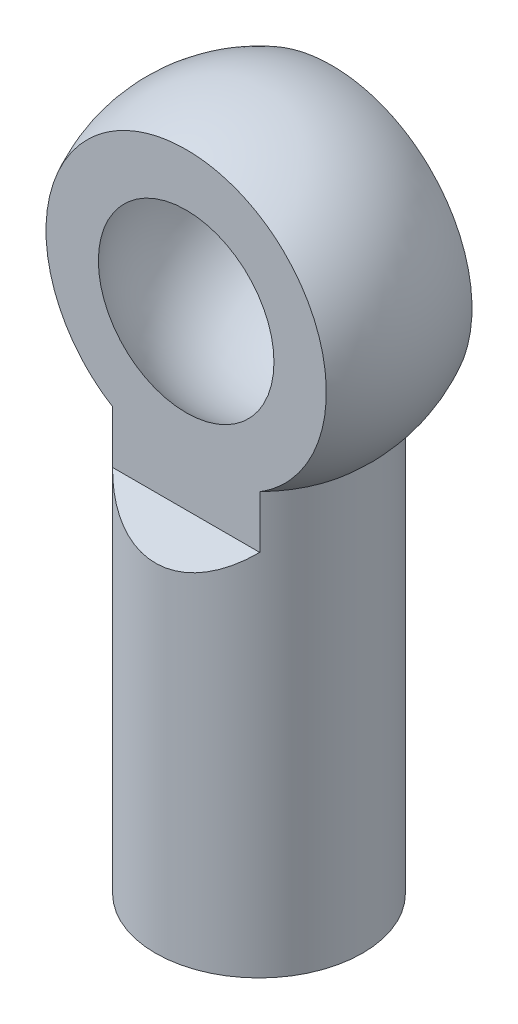
ISO-10303-21;
HEADER;
FILE_DESCRIPTION(('STEP AP214'),'2;1');
FILE_NAME('part.step','',(''),(''),'','','');
FILE_SCHEMA(('AUTOMOTIVE_DESIGN { 1 0 10303 214 1 1 1 1 }'));
ENDSEC;
DATA;
#1=APPLICATION_CONTEXT('core data for automotive mechanical design processes');
#2=APPLICATION_PROTOCOL_DEFINITION('international standard','automotive_design',2000,#1);
#3=PRODUCT_CONTEXT('',#1,'mechanical');
#4=PRODUCT('Part','Part','',(#3));
#5=PRODUCT_RELATED_PRODUCT_CATEGORY('part','',(#4));
#6=PRODUCT_DEFINITION_FORMATION('','',#4);
#7=PRODUCT_DEFINITION_CONTEXT('part definition',#1,'design');
#8=PRODUCT_DEFINITION('design','',#6,#7);
#9=PRODUCT_DEFINITION_SHAPE('','',#8);
#10=(LENGTH_UNIT() NAMED_UNIT(*) SI_UNIT(.MILLI.,.METRE.));
#11=(NAMED_UNIT(*) PLANE_ANGLE_UNIT() SI_UNIT($,.RADIAN.));
#12=(NAMED_UNIT(*) SI_UNIT($,.STERADIAN.) SOLID_ANGLE_UNIT());
#13=UNCERTAINTY_MEASURE_WITH_UNIT(LENGTH_MEASURE(1.E-05),#10,'distance_accuracy_value','');
#14=(GEOMETRIC_REPRESENTATION_CONTEXT(3) GLOBAL_UNCERTAINTY_ASSIGNED_CONTEXT((#13)) GLOBAL_UNIT_ASSIGNED_CONTEXT((#10,
#11,#12)) REPRESENTATION_CONTEXT('',''));
#15=CARTESIAN_POINT('',(0.,0.,0.));
#16=DIRECTION('',(0.,0.,1.));
#17=DIRECTION('',(1.,0.,0.));
#18=AXIS2_PLACEMENT_3D('',#15,#16,#17);
#19=CARTESIAN_POINT('',(-4.5,20.3907899194006,-2.075));
#20=DIRECTION('',(0.,0.,1.));
#21=DIRECTION('',(0.,-1.,0.));
#22=AXIS2_PLACEMENT_3D('',#19,#20,#21);
#23=PLANE('',#22);
#24=CARTESIAN_POINT('',(0.,15.3981612675092,-2.075));
#25=DIRECTION('',(0.,0.,1.));
#26=DIRECTION('',(0.,-1.,0.));
#27=AXIS2_PLACEMENT_3D('',#24,#25,#26);
#28=CIRCLE('',#27,3.99304082122885);
#29=CARTESIAN_POINT('',(2.0968726713847,12.,-2.075));
#30=VERTEX_POINT('',#29);
#31=CARTESIAN_POINT('',(-2.0968726713847,12.,-2.075));
#32=VERTEX_POINT('',#31);
#33=EDGE_CURVE('E122',#30,#32,#28,.T.);
#34=ORIENTED_EDGE('',*,*,#33,.F.);
#35=DIRECTION('',(0.,-1.,0.));
#36=VECTOR('',#35,1.);
#37=CARTESIAN_POINT('',(2.0968726713847,12.,-2.075));
#38=LINE('',#37,#36);
#39=CARTESIAN_POINT('',(2.0968726713847,10.5,-2.075));
#40=VERTEX_POINT('',#39);
#41=EDGE_CURVE('E95',#40,#30,#38,.F.);
#42=ORIENTED_EDGE('',*,*,#41,.F.);
#43=DIRECTION('',(1.,0.,0.));
#44=VECTOR('',#43,1.);
#45=CARTESIAN_POINT('',(-4.5,10.5,-2.075));
#46=LINE('',#45,#44);
#47=CARTESIAN_POINT('',(-2.0968726713847,10.5,-2.075));
#48=VERTEX_POINT('',#47);
#49=EDGE_CURVE('E89',#48,#40,#46,.T.);
#50=ORIENTED_EDGE('',*,*,#49,.F.);
#51=DIRECTION('',(0.,-1.,0.));
#52=VECTOR('',#51,1.);
#53=CARTESIAN_POINT('',(-2.0968726713847,12.,-2.075));
#54=LINE('',#53,#52);
#55=EDGE_CURVE('E59',#32,#48,#54,.T.);
#56=ORIENTED_EDGE('',*,*,#55,.F.);
#57=EDGE_LOOP('',(#34,#42,#50,#56));
#58=FACE_BOUND('',#57,.T.);
#59=CARTESIAN_POINT('',(0.,15.3981612675092,-2.075));
#60=DIRECTION('',(0.,0.,1.));
#61=DIRECTION('',(0.,-1.,0.));
#62=AXIS2_PLACEMENT_3D('',#59,#60,#61);
#63=CIRCLE('',#62,3.40000005799999);
#64=CARTESIAN_POINT('',(0.,11.9981612095092,-2.075));
#65=VERTEX_POINT('',#64);
#66=EDGE_CURVE('E13',#65,#65,#63,.F.);
#67=ORIENTED_EDGE('',*,*,#66,.F.);
#68=EDGE_LOOP('',(#67));
#69=FACE_BOUND('',#68,.T.);
#70=ADVANCED_FACE('F44',(#58,#69),#23,.F.);
#71=CARTESIAN_POINT('',(0.,12.,0.));
#72=DIRECTION('',(0.,-1.,0.));
#73=DIRECTION('',(0.,0.,-1.));
#74=AXIS2_PLACEMENT_3D('',#71,#72,#73);
#75=CYLINDRICAL_SURFACE('',#74,2.95);
#76=CARTESIAN_POINT('',(0.,12.,0.));
#77=DIRECTION('',(0.,1.,0.));
#78=DIRECTION('',(0.,0.,1.));
#79=AXIS2_PLACEMENT_3D('',#76,#77,#78);
#80=CIRCLE('',#79,2.95);
#81=CARTESIAN_POINT('',(2.0968726713847,12.,2.075));
#82=VERTEX_POINT('',#81);
#83=EDGE_CURVE('E119',#82,#30,#80,.T.);
#84=ORIENTED_EDGE('',*,*,#83,.F.);
#85=DIRECTION('',(0.,-1.,0.));
#86=VECTOR('',#85,1.);
#87=CARTESIAN_POINT('',(2.0968726713847,12.,2.075));
#88=LINE('',#87,#86);
#89=CARTESIAN_POINT('',(2.0968726713847,10.5,2.075));
#90=VERTEX_POINT('',#89);
#91=EDGE_CURVE('E67',#82,#90,#88,.T.);
#92=ORIENTED_EDGE('',*,*,#91,.T.);
#93=CARTESIAN_POINT('',(0.,12.575,0.));
#94=DIRECTION('',(0.,-0.707106781186544,-0.707106781186551));
#95=DIRECTION('',(0.,-0.707106781186551,0.707106781186544));
#96=AXIS2_PLACEMENT_3D('',#93,#94,#95);
#97=ELLIPSE('',#96,4.17193000900066,2.95);
#98=CARTESIAN_POINT('',(-2.0968726713847,10.5,2.075));
#99=VERTEX_POINT('',#98);
#100=EDGE_CURVE('E52',#90,#99,#97,.T.);
#101=ORIENTED_EDGE('',*,*,#100,.T.);
#102=DIRECTION('',(0.,-1.,0.));
#103=VECTOR('',#102,1.);
#104=CARTESIAN_POINT('',(-2.0968726713847,12.,2.075));
#105=LINE('',#104,#103);
#106=CARTESIAN_POINT('',(-2.0968726713847,12.,2.075));
#107=VERTEX_POINT('',#106);
#108=EDGE_CURVE('E105',#99,#107,#105,.F.);
#109=ORIENTED_EDGE('',*,*,#108,.T.);
#110=EDGE_CURVE('E104',#32,#107,#80,.T.);
#111=ORIENTED_EDGE('',*,*,#110,.F.);
#112=ORIENTED_EDGE('',*,*,#55,.T.);
#113=CARTESIAN_POINT('',(0.,12.575,0.));
#114=DIRECTION('',(0.,-0.707106781186544,0.707106781186551));
#115=DIRECTION('',(0.,-0.707106781186551,-0.707106781186544));
#116=AXIS2_PLACEMENT_3D('',#113,#114,#115);
#117=ELLIPSE('',#116,4.17193000900066,2.95);
#118=EDGE_CURVE('E87',#48,#40,#117,.T.);
#119=ORIENTED_EDGE('',*,*,#118,.T.);
#120=ORIENTED_EDGE('',*,*,#41,.T.);
#121=EDGE_LOOP('',(#84,#92,#101,#109,#111,#112,#119,#120));
#122=FACE_BOUND('',#121,.T.);
#123=CARTESIAN_POINT('',(0.,0.,0.));
#124=DIRECTION('',(0.,1.,0.));
#125=DIRECTION('',(0.,0.,1.));
#126=AXIS2_PLACEMENT_3D('',#123,#124,#125);
#127=CIRCLE('',#126,2.95);
#128=CARTESIAN_POINT('',(0.,0.,2.95));
#129=VERTEX_POINT('',#128);
#130=EDGE_CURVE('E115',#129,#129,#127,.T.);
#131=ORIENTED_EDGE('',*,*,#130,.T.);
#132=EDGE_LOOP('',(#131));
#133=FACE_BOUND('',#132,.T.);
#134=ADVANCED_FACE('F46',(#122,#133),#75,.T.);
#135=CARTESIAN_POINT('',(0.,0.,0.));
#136=DIRECTION('',(0.,1.,0.));
#137=DIRECTION('',(0.,0.,1.));
#138=AXIS2_PLACEMENT_3D('',#135,#136,#137);
#139=PLANE('',#138);
#140=CARTESIAN_POINT('',(0.,0.,0.));
#141=DIRECTION('',(0.,-1.,0.));
#142=DIRECTION('',(0.,0.,-1.));
#143=AXIS2_PLACEMENT_3D('',#140,#141,#142);
#144=CIRCLE('',#143,1.5);
#145=CARTESIAN_POINT('',(0.,0.,-1.5));
#146=VERTEX_POINT('',#145);
#147=EDGE_CURVE('E116',#146,#146,#144,.T.);
#148=ORIENTED_EDGE('',*,*,#147,.F.);
#149=EDGE_LOOP('',(#148));
#150=FACE_BOUND('',#149,.T.);
#151=ORIENTED_EDGE('',*,*,#130,.F.);
#152=EDGE_LOOP('',(#151));
#153=FACE_BOUND('',#152,.T.);
#154=ADVANCED_FACE('F166',(#150,#153),#139,.F.);
#155=CARTESIAN_POINT('',(0.,11.,0.));
#156=DIRECTION('',(0.,-1.,0.));
#157=DIRECTION('',(0.,0.,-1.));
#158=AXIS2_PLACEMENT_3D('',#155,#156,#157);
#159=CYLINDRICAL_SURFACE('',#158,1.5);
#160=CARTESIAN_POINT('',(0.,11.,0.));
#161=DIRECTION('',(0.,-1.,0.));
#162=DIRECTION('',(0.,0.,-1.));
#163=AXIS2_PLACEMENT_3D('',#160,#161,#162);
#164=CIRCLE('',#163,1.5);
#165=CARTESIAN_POINT('',(0.,11.,-1.5));
#166=VERTEX_POINT('',#165);
#167=EDGE_CURVE('E112',#166,#166,#164,.T.);
#168=ORIENTED_EDGE('',*,*,#167,.F.);
#169=EDGE_LOOP('',(#168));
#170=FACE_BOUND('',#169,.T.);
#171=ORIENTED_EDGE('',*,*,#147,.T.);
#172=EDGE_LOOP('',(#171));
#173=FACE_BOUND('',#172,.T.);
#174=ADVANCED_FACE('F245',(#170,#173),#159,.F.);
#175=CARTESIAN_POINT('',(0.,11.,0.));
#176=DIRECTION('',(0.,-1.,0.));
#177=DIRECTION('',(0.,0.,-1.));
#178=AXIS2_PLACEMENT_3D('',#175,#176,#177);
#179=PLANE('',#178);
#180=CARTESIAN_POINT('',(0.,11.,0.));
#181=DIRECTION('',(0.,-1.,0.));
#182=DIRECTION('',(0.,0.,-1.));
#183=AXIS2_PLACEMENT_3D('',#180,#181,#182);
#184=CIRCLE('',#183,0.951933540212518);
#185=CARTESIAN_POINT('',(0.,11.,-0.951933540212518));
#186=VERTEX_POINT('',#185);
#187=EDGE_CURVE('E111',#186,#186,#184,.F.);
#188=ORIENTED_EDGE('',*,*,#187,.T.);
#189=EDGE_LOOP('',(#188));
#190=FACE_BOUND('',#189,.T.);
#191=ORIENTED_EDGE('',*,*,#167,.T.);
#192=EDGE_LOOP('',(#191));
#193=FACE_BOUND('',#192,.T.);
#194=ADVANCED_FACE('F158',(#190,#193),#179,.T.);
#195=CARTESIAN_POINT('',(0.,15.3981612675092,0.));
#196=DIRECTION('',(0.,1.,0.));
#197=DIRECTION('',(0.,0.,-1.));
#198=AXIS2_PLACEMENT_3D('',#195,#196,#197);
#199=SPHERICAL_SURFACE('',#198,4.5);
#200=ORIENTED_EDGE('',*,*,#187,.F.);
#201=EDGE_LOOP('',(#200));
#202=FACE_BOUND('',#201,.T.);
#203=ADVANCED_FACE('F150',(#202),#199,.T.);
#204=ORIENTED_EDGE('',*,*,#110,.T.);
#205=CARTESIAN_POINT('',(0.,15.3981612675092,2.075));
#206=DIRECTION('',(0.,0.,-1.));
#207=DIRECTION('',(0.,1.,0.));
#208=AXIS2_PLACEMENT_3D('',#205,#206,#207);
#209=CIRCLE('',#208,3.99304082122885);
#210=EDGE_CURVE('E92',#107,#82,#209,.T.);
#211=ORIENTED_EDGE('',*,*,#210,.T.);
#212=ORIENTED_EDGE('',*,*,#83,.T.);
#213=ORIENTED_EDGE('',*,*,#33,.T.);
#214=EDGE_LOOP('',(#204,#211,#212,#213));
#215=FACE_BOUND('',#214,.T.);
#216=ADVANCED_FACE('F148',(#215),#199,.T.);
#217=CARTESIAN_POINT('',(-4.5,10.5,-2.075));
#218=DIRECTION('',(0.,-0.707106781186544,0.707106781186551));
#219=DIRECTION('',(0.,-0.707106781186551,-0.707106781186544));
#220=AXIS2_PLACEMENT_3D('',#217,#218,#219);
#221=PLANE('',#220);
#222=ORIENTED_EDGE('',*,*,#49,.T.);
#223=ORIENTED_EDGE('',*,*,#118,.F.);
#224=EDGE_LOOP('',(#222,#223));
#225=FACE_BOUND('',#224,.T.);
#226=ADVANCED_FACE('F88',(#225),#221,.F.);
#227=CARTESIAN_POINT('',(-4.5,10.5,2.075));
#228=DIRECTION('',(0.,-0.707106781186544,-0.707106781186551));
#229=DIRECTION('',(0.,0.707106781186551,-0.707106781186544));
#230=AXIS2_PLACEMENT_3D('',#227,#228,#229);
#231=PLANE('',#230);
#232=DIRECTION('',(1.,0.,0.));
#233=VECTOR('',#232,1.);
#234=CARTESIAN_POINT('',(-4.5,10.5,2.075));
#235=LINE('',#234,#233);
#236=EDGE_CURVE('E96',#99,#90,#235,.T.);
#237=ORIENTED_EDGE('',*,*,#236,.F.);
#238=ORIENTED_EDGE('',*,*,#100,.F.);
#239=EDGE_LOOP('',(#237,#238));
#240=FACE_BOUND('',#239,.T.);
#241=ADVANCED_FACE('F156',(#240),#231,.F.);
#242=CARTESIAN_POINT('',(-4.5,20.3907899194006,2.075));
#243=DIRECTION('',(0.,0.,-1.));
#244=DIRECTION('',(0.,1.,0.));
#245=AXIS2_PLACEMENT_3D('',#242,#243,#244);
#246=PLANE('',#245);
#247=CARTESIAN_POINT('',(0.,15.3981612675092,2.075));
#248=DIRECTION('',(0.,0.,-1.));
#249=DIRECTION('',(0.,1.,0.));
#250=AXIS2_PLACEMENT_3D('',#247,#248,#249);
#251=CIRCLE('',#250,2.50137462208283);
#252=CARTESIAN_POINT('',(0.,17.8995358895921,2.075));
#253=VERTEX_POINT('',#252);
#254=EDGE_CURVE('E97',#253,#253,#251,.F.);
#255=ORIENTED_EDGE('',*,*,#254,.F.);
#256=EDGE_LOOP('',(#255));
#257=FACE_BOUND('',#256,.T.);
#258=ORIENTED_EDGE('',*,*,#210,.F.);
#259=ORIENTED_EDGE('',*,*,#108,.F.);
#260=ORIENTED_EDGE('',*,*,#236,.T.);
#261=ORIENTED_EDGE('',*,*,#91,.F.);
#262=EDGE_LOOP('',(#258,#259,#260,#261));
#263=FACE_BOUND('',#262,.T.);
#264=ADVANCED_FACE('F145',(#257,#263),#246,.F.);
#265=CARTESIAN_POINT('',(0.,15.3981612675092,0.));
#266=DIRECTION('',(0.,0.,1.));
#267=DIRECTION('',(0.,1.,0.));
#268=AXIS2_PLACEMENT_3D('',#265,#266,#267);
#269=SPHERICAL_SURFACE('',#268,3.25);
#270=CARTESIAN_POINT('',(0.,15.3981612675092,-2.075));
#271=DIRECTION('',(0.,0.,-1.));
#272=DIRECTION('',(0.,1.,0.));
#273=AXIS2_PLACEMENT_3D('',#270,#271,#272);
#274=CIRCLE('',#273,2.50137462208283);
#275=CARTESIAN_POINT('',(0.,17.8995358895921,-2.075));
#276=VERTEX_POINT('',#275);
#277=EDGE_CURVE('E140',#276,#276,#274,.T.);
#278=CARTESIAN_POINT('',(0.,17.8995358895921,2.075));
#279=CARTESIAN_POINT('',(0.,17.9294725313673,2.03891299293474));
#280=CARTESIAN_POINT('',(0.,17.9586271577245,2.00217733623271));
#281=CARTESIAN_POINT('',(0.,18.0153201615577,1.92747934004052));
#282=CARTESIAN_POINT('',(0.,18.0428585390337,1.88951700055036));
#283=CARTESIAN_POINT('',(0.,18.0962668270596,1.81243625526729));
#284=CARTESIAN_POINT('',(0.,18.1221367376094,1.77331784947439));
#285=CARTESIAN_POINT('',(0.,18.1721598098411,1.69399836896055));
#286=CARTESIAN_POINT('',(0.,18.1963129715228,1.65379729423961));
#287=CARTESIAN_POINT('',(0.,18.2428572621402,1.57238773608666));
#288=CARTESIAN_POINT('',(0.,18.2652483910759,1.53117925265464));
#289=CARTESIAN_POINT('',(0.,18.3082266907792,1.44783206833414));
#290=CARTESIAN_POINT('',(0.,18.328813861547,1.40569336744566));
#291=CARTESIAN_POINT('',(0.,18.3681456826332,1.3205646698853));
#292=CARTESIAN_POINT('',(0.,18.3868903329516,1.27757467321342));
#293=CARTESIAN_POINT('',(0.,18.4225020060094,1.19082390337721));
#294=CARTESIAN_POINT('',(0.,18.4393690287487,1.14706313021287));
#295=CARTESIAN_POINT('',(0.,18.4711938551225,1.05885276946726));
#296=CARTESIAN_POINT('',(0.,18.4861516587571,1.01440318188599));
#297=CARTESIAN_POINT('',(0.,18.5141300315906,0.924898444732943));
#298=CARTESIAN_POINT('',(0.,18.5271506007895,0.87984329516117));
#299=CARTESIAN_POINT('',(0.,18.5512301177063,0.789211820586969));
#300=CARTESIAN_POINT('',(0.,18.5622890654242,0.743635495584541));
#301=CARTESIAN_POINT('',(0.,18.5824246263973,0.65204703286689));
#302=CARTESIAN_POINT('',(0.,18.5915012396525,0.606034895151668));
#303=CARTESIAN_POINT('',(0.,18.6076551315491,0.513660985982457));
#304=CARTESIAN_POINT('',(0.,18.6147324101907,0.467299214528469));
#305=CARTESIAN_POINT('',(0.,18.6268743773881,0.374312871707555));
#306=CARTESIAN_POINT('',(0.,18.631939065944,0.32768830034063));
#307=CARTESIAN_POINT('',(0.,18.640046367002,0.234263683733547));
#308=CARTESIAN_POINT('',(0.,18.6430889795041,0.187463638493389));
#309=CARTESIAN_POINT('',(0.,18.6471464297578,0.0937757288354877));
#310=CARTESIAN_POINT('',(0.,18.6481612675092,0.0468878644177435));
#311=CARTESIAN_POINT('',(0.,18.6481612675092,-0.046887864417745));
#312=CARTESIAN_POINT('',(0.,18.6471464297578,-0.0937757288354892));
#313=CARTESIAN_POINT('',(0.,18.6430889795041,-0.187463638493391));
#314=CARTESIAN_POINT('',(0.,18.640046367002,-0.234263683733548));
#315=CARTESIAN_POINT('',(0.,18.631939065944,-0.327688300340631));
#316=CARTESIAN_POINT('',(0.,18.6268743773881,-0.374312871707557));
#317=CARTESIAN_POINT('',(0.,18.6147324101907,-0.46729921452847));
#318=CARTESIAN_POINT('',(0.,18.6076551315491,-0.513660985982459));
#319=CARTESIAN_POINT('',(0.,18.5915012396525,-0.60603489515167));
#320=CARTESIAN_POINT('',(0.,18.5824246263973,-0.652047032866892));
#321=CARTESIAN_POINT('',(0.,18.5622890654242,-0.743635495584542));
#322=CARTESIAN_POINT('',(0.,18.5512301177063,-0.78921182058697));
#323=CARTESIAN_POINT('',(0.,18.5271506007895,-0.879843295161171));
#324=CARTESIAN_POINT('',(0.,18.5141300315906,-0.924898444732944));
#325=CARTESIAN_POINT('',(0.,18.4861516587571,-1.01440318188599));
#326=CARTESIAN_POINT('',(0.,18.4711938551225,-1.05885276946726));
#327=CARTESIAN_POINT('',(0.,18.4393690287487,-1.14706313021287));
#328=CARTESIAN_POINT('',(0.,18.4225020060094,-1.19082390337721));
#329=CARTESIAN_POINT('',(0.,18.3868903329516,-1.27757467321343));
#330=CARTESIAN_POINT('',(0.,18.3681456826332,-1.3205646698853));
#331=CARTESIAN_POINT('',(0.,18.328813861547,-1.40569336744566));
#332=CARTESIAN_POINT('',(0.,18.3082266907792,-1.44783206833415));
#333=CARTESIAN_POINT('',(0.,18.2652483910759,-1.53117925265464));
#334=CARTESIAN_POINT('',(0.,18.2428572621402,-1.57238773608666));
#335=CARTESIAN_POINT('',(0.,18.1963129715228,-1.65379729423961));
#336=CARTESIAN_POINT('',(0.,18.1721598098411,-1.69399836896056));
#337=CARTESIAN_POINT('',(0.,18.1221367376094,-1.7733178494744));
#338=CARTESIAN_POINT('',(0.,18.0962668270596,-1.8124362552673));
#339=CARTESIAN_POINT('',(0.,18.0428585390337,-1.88951700055036));
#340=CARTESIAN_POINT('',(0.,18.0153201615577,-1.92747934004052));
#341=CARTESIAN_POINT('',(0.,17.9586271577245,-2.00217733623271));
#342=CARTESIAN_POINT('',(0.,17.9294725313673,-2.03891299293474));
#343=CARTESIAN_POINT('',(0.,17.8995358895921,-2.075));
#344=B_SPLINE_CURVE_WITH_KNOTS('',3,(#278,#279,#280,#281,#282,#283,#284,#285,#286,#287,#288,
#289,#290,#291,#292,#293,#294,#295,#296,#297,#298,#299,#300,#301,#302,#303,#304,#305,#306,#307,
#308,#309,#310,#311,#312,#313,#314,#315,#316,#317,#318,#319,#320,#321,#322,#323,#324,#325,#326,
#327,#328,#329,#330,#331,#332,#333,#334,#335,#336,#337,#338,#339,#340,#341,#342,#343),
.UNSPECIFIED.,.F.,.F.,(4,2,2,2,2,2,2,2,2,2,2,2,2,2,2,2,2,2,2,2,2,2,2,2,2,2,2,2,2,2,2,2,4),(0.,
0.140652617141955,0.281305234283908,0.421957851425862,0.562610468567816,0.70326308570977,
0.843915702851723,0.984568319993677,1.12522093713563,1.26587355427758,1.40652617141954,
1.54717878856149,1.68783140570345,1.8284840228454,1.96913663998735,2.10978925712931,
2.25044187427126,2.39109449141322,2.53174710855517,2.67239972569712,2.81305234283908,
2.95370495998103,3.09435757712299,3.23501019426494,3.37566281140689,3.51631542854885,
3.6569680456908,3.79762066283276,3.93827327997471,4.07892589711666,4.21957851425862,
4.36023113140057,4.50088374854252),.UNSPECIFIED.);
#345=EDGE_CURVE('BSEAM172',#253,#276,#344,.T.);
#346=ORIENTED_EDGE('',*,*,#254,.T.);
#347=ORIENTED_EDGE('',*,*,#277,.T.);
#348=ORIENTED_EDGE('',*,*,#345,.T.);
#349=ORIENTED_EDGE('',*,*,#345,.F.);
#350=EDGE_LOOP('',(#346,#348,#347,#349));
#351=FACE_BOUND('',#350,.T.);
#352=ADVANCED_FACE('F172',(#351),#269,.F.);
#353=CARTESIAN_POINT('',(0.,15.3981612675092,-2.095));
#354=DIRECTION('',(0.,0.,-1.));
#355=DIRECTION('',(0.,1.,0.));
#356=AXIS2_PLACEMENT_3D('',#353,#354,#355);
#357=PLANE('',#356);
#358=CARTESIAN_POINT('',(0.,15.3981612675092,-2.095));
#359=DIRECTION('',(0.,0.,-1.));
#360=DIRECTION('',(0.,1.,0.));
#361=AXIS2_PLACEMENT_3D('',#358,#359,#360);
#362=CIRCLE('',#361,3.40000005799999);
#363=CARTESIAN_POINT('',(0.,11.9981612095092,-2.095));
#364=VERTEX_POINT('',#363);
#365=EDGE_CURVE('E131',#364,#364,#362,.T.);
#366=ORIENTED_EDGE('',*,*,#365,.T.);
#367=EDGE_LOOP('',(#366));
#368=FACE_BOUND('',#367,.T.);
#369=CARTESIAN_POINT('',(0.,15.3981612675092,-2.095));
#370=DIRECTION('',(0.,0.,-1.));
#371=DIRECTION('',(0.,1.,0.));
#372=AXIS2_PLACEMENT_3D('',#369,#370,#371);
#373=CIRCLE('',#372,2.50137462208283);
#374=CARTESIAN_POINT('',(0.,17.8995358895921,-2.095));
#375=VERTEX_POINT('',#374);
#376=EDGE_CURVE('E135',#375,#375,#373,.T.);
#377=ORIENTED_EDGE('',*,*,#376,.F.);
#378=EDGE_LOOP('',(#377));
#379=FACE_BOUND('',#378,.T.);
#380=ADVANCED_FACE('F176',(#368,#379),#357,.T.);
#381=CARTESIAN_POINT('',(0.,15.3981612675092,-2.095));
#382=DIRECTION('',(0.,0.,1.));
#383=DIRECTION('',(0.,-1.,0.));
#384=AXIS2_PLACEMENT_3D('',#381,#382,#383);
#385=CYLINDRICAL_SURFACE('',#384,3.40000005799999);
#386=CARTESIAN_POINT('',(0.,11.9981612095092,-2.095));
#387=CARTESIAN_POINT('',(0.,11.9981612095092,-2.09479166666667));
#388=CARTESIAN_POINT('',(0.,11.9981612095092,-2.09458333333333));
#389=CARTESIAN_POINT('',(0.,11.9981612095092,-2.09416666666667));
#390=CARTESIAN_POINT('',(0.,11.9981612095092,-2.09395833333333));
#391=CARTESIAN_POINT('',(0.,11.9981612095092,-2.09354166666667));
#392=CARTESIAN_POINT('',(0.,11.9981612095092,-2.09333333333333));
#393=CARTESIAN_POINT('',(0.,11.9981612095092,-2.09291666666667));
#394=CARTESIAN_POINT('',(0.,11.9981612095092,-2.09270833333333));
#395=CARTESIAN_POINT('',(0.,11.9981612095092,-2.09229166666667));
#396=CARTESIAN_POINT('',(0.,11.9981612095092,-2.09208333333333));
#397=CARTESIAN_POINT('',(0.,11.9981612095092,-2.09166666666667));
#398=CARTESIAN_POINT('',(0.,11.9981612095092,-2.09145833333333));
#399=CARTESIAN_POINT('',(0.,11.9981612095092,-2.09104166666667));
#400=CARTESIAN_POINT('',(0.,11.9981612095092,-2.09083333333333));
#401=CARTESIAN_POINT('',(0.,11.9981612095092,-2.09041666666667));
#402=CARTESIAN_POINT('',(0.,11.9981612095092,-2.09020833333333));
#403=CARTESIAN_POINT('',(0.,11.9981612095092,-2.08979166666667));
#404=CARTESIAN_POINT('',(0.,11.9981612095092,-2.08958333333333));
#405=CARTESIAN_POINT('',(0.,11.9981612095092,-2.08916666666667));
#406=CARTESIAN_POINT('',(0.,11.9981612095092,-2.08895833333333));
#407=CARTESIAN_POINT('',(0.,11.9981612095092,-2.08854166666667));
#408=CARTESIAN_POINT('',(0.,11.9981612095092,-2.08833333333333));
#409=CARTESIAN_POINT('',(0.,11.9981612095092,-2.08791666666667));
#410=CARTESIAN_POINT('',(0.,11.9981612095092,-2.08770833333333));
#411=CARTESIAN_POINT('',(0.,11.9981612095092,-2.08729166666667));
#412=CARTESIAN_POINT('',(0.,11.9981612095092,-2.08708333333333));
#413=CARTESIAN_POINT('',(0.,11.9981612095092,-2.08666666666667));
#414=CARTESIAN_POINT('',(0.,11.9981612095092,-2.08645833333333));
#415=CARTESIAN_POINT('',(0.,11.9981612095092,-2.08604166666667));
#416=CARTESIAN_POINT('',(0.,11.9981612095092,-2.08583333333333));
#417=CARTESIAN_POINT('',(0.,11.9981612095092,-2.08541666666667));
#418=CARTESIAN_POINT('',(0.,11.9981612095092,-2.08520833333333));
#419=CARTESIAN_POINT('',(0.,11.9981612095092,-2.08479166666667));
#420=CARTESIAN_POINT('',(0.,11.9981612095092,-2.08458333333333));
#421=CARTESIAN_POINT('',(0.,11.9981612095092,-2.08416666666667));
#422=CARTESIAN_POINT('',(0.,11.9981612095092,-2.08395833333333));
#423=CARTESIAN_POINT('',(0.,11.9981612095092,-2.08354166666667));
#424=CARTESIAN_POINT('',(0.,11.9981612095092,-2.08333333333333));
#425=CARTESIAN_POINT('',(0.,11.9981612095092,-2.08291666666667));
#426=CARTESIAN_POINT('',(0.,11.9981612095092,-2.08270833333333));
#427=CARTESIAN_POINT('',(0.,11.9981612095092,-2.08229166666667));
#428=CARTESIAN_POINT('',(0.,11.9981612095092,-2.08208333333333));
#429=CARTESIAN_POINT('',(0.,11.9981612095092,-2.08166666666667));
#430=CARTESIAN_POINT('',(0.,11.9981612095092,-2.08145833333333));
#431=CARTESIAN_POINT('',(0.,11.9981612095092,-2.08104166666666));
#432=CARTESIAN_POINT('',(0.,11.9981612095092,-2.08083333333333));
#433=CARTESIAN_POINT('',(0.,11.9981612095092,-2.08041666666667));
#434=CARTESIAN_POINT('',(0.,11.9981612095092,-2.08020833333333));
#435=CARTESIAN_POINT('',(0.,11.9981612095092,-2.07979166666667));
#436=CARTESIAN_POINT('',(0.,11.9981612095092,-2.07958333333333));
#437=CARTESIAN_POINT('',(0.,11.9981612095092,-2.07916666666667));
#438=CARTESIAN_POINT('',(0.,11.9981612095092,-2.07895833333333));
#439=CARTESIAN_POINT('',(0.,11.9981612095092,-2.07854166666666));
#440=CARTESIAN_POINT('',(0.,11.9981612095092,-2.07833333333333));
#441=CARTESIAN_POINT('',(0.,11.9981612095092,-2.07791666666667));
#442=CARTESIAN_POINT('',(0.,11.9981612095092,-2.07770833333333));
#443=CARTESIAN_POINT('',(0.,11.9981612095092,-2.07729166666667));
#444=CARTESIAN_POINT('',(0.,11.9981612095092,-2.07708333333333));
#445=CARTESIAN_POINT('',(0.,11.9981612095092,-2.07666666666666));
#446=CARTESIAN_POINT('',(0.,11.9981612095092,-2.07645833333333));
#447=CARTESIAN_POINT('',(0.,11.9981612095092,-2.07604166666667));
#448=CARTESIAN_POINT('',(0.,11.9981612095092,-2.07583333333333));
#449=CARTESIAN_POINT('',(0.,11.9981612095092,-2.07541666666667));
#450=CARTESIAN_POINT('',(0.,11.9981612095092,-2.07520833333333));
#451=CARTESIAN_POINT('',(0.,11.9981612095092,-2.075));
#452=B_SPLINE_CURVE_WITH_KNOTS('',3,(#386,#387,#388,#389,#390,#391,#392,#393,#394,#395,#396,
#397,#398,#399,#400,#401,#402,#403,#404,#405,#406,#407,#408,#409,#410,#411,#412,#413,#414,#415,
#416,#417,#418,#419,#420,#421,#422,#423,#424,#425,#426,#427,#428,#429,#430,#431,#432,#433,#434,
#435,#436,#437,#438,#439,#440,#441,#442,#443,#444,#445,#446,#447,#448,#449,#450,#451),
.UNSPECIFIED.,.F.,.F.,(4,2,2,2,2,2,2,2,2,2,2,2,2,2,2,2,2,2,2,2,2,2,2,2,2,2,2,2,2,2,2,2,4),(0.,
0.000625000000000191,0.00125000000000038,0.00187500000000014,0.00250000000000033,
0.00312500000000009,0.00375000000000028,0.00437500000000047,0.00500000000000023,
0.00562500000000042,0.00625000000000018,0.00687500000000037,0.00750000000000056,
0.00812500000000032,0.00875000000000051,0.00937500000000027,0.0100000000000005,
0.0106250000000007,0.0112500000000004,0.0118750000000006,0.0125000000000004,0.0131250000000005,
0.0137500000000007,0.0143750000000005,0.0150000000000007,0.0156250000000004,0.0162500000000006,
0.0168750000000008,0.0175000000000006,0.0181250000000008,0.0187500000000005,0.0193750000000007,
0.0200000000000009),.UNSPECIFIED.);
#453=EDGE_CURVE('BSEAM177',#364,#65,#452,.T.);
#454=ORIENTED_EDGE('',*,*,#365,.F.);
#455=ORIENTED_EDGE('',*,*,#66,.T.);
#456=ORIENTED_EDGE('',*,*,#453,.T.);
#457=ORIENTED_EDGE('',*,*,#453,.F.);
#458=EDGE_LOOP('',(#454,#456,#455,#457));
#459=FACE_BOUND('',#458,.T.);
#460=ADVANCED_FACE('F177',(#459),#385,.T.);
#461=CARTESIAN_POINT('',(0.,15.3981612675092,-2.095));
#462=DIRECTION('',(0.,0.,1.));
#463=DIRECTION('',(0.,-1.,0.));
#464=AXIS2_PLACEMENT_3D('',#461,#462,#463);
#465=CYLINDRICAL_SURFACE('',#464,2.50137462208283);
#466=ORIENTED_EDGE('',*,*,#376,.T.);
#467=EDGE_LOOP('',(#466));
#468=FACE_BOUND('',#467,.T.);
#469=ORIENTED_EDGE('',*,*,#277,.F.);
#470=EDGE_LOOP('',(#469));
#471=FACE_BOUND('',#470,.T.);
#472=ADVANCED_FACE('F180',(#468,#471),#465,.F.);
#473=CLOSED_SHELL('',(#70,#134,#154,#174,#194,#203,#216,#226,#241,#264,#352,#380,#460,#472));
#474=MANIFOLD_SOLID_BREP('B2',#473);
#475=ADVANCED_BREP_SHAPE_REPRESENTATION('',(#18,#474),#14);
#476=SHAPE_DEFINITION_REPRESENTATION(#9,#475);
ENDSEC;
END-ISO-10303-21;
